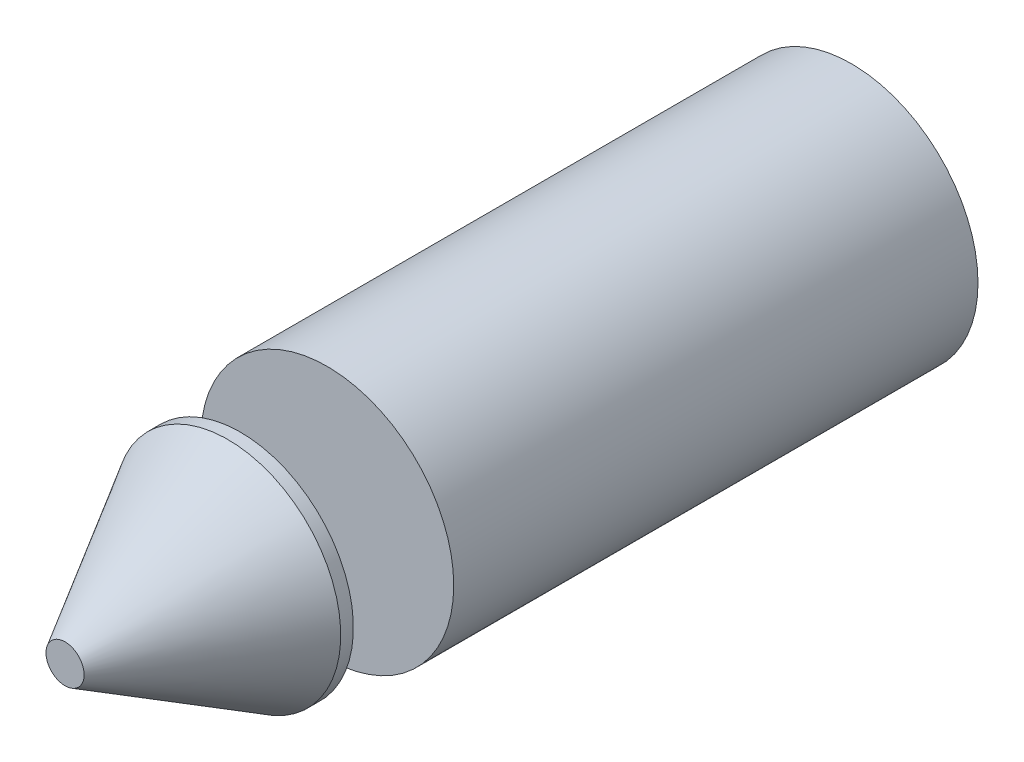
ISO-10303-21;
HEADER;
FILE_DESCRIPTION(('STEP AP214'),'2;1');
FILE_NAME('part.step','',(''),(''),'','','');
FILE_SCHEMA(('AUTOMOTIVE_DESIGN { 1 0 10303 214 1 1 1 1 }'));
ENDSEC;
DATA;
#1=APPLICATION_CONTEXT('core data for automotive mechanical design processes');
#2=APPLICATION_PROTOCOL_DEFINITION('international standard','automotive_design',2000,#1);
#3=PRODUCT_CONTEXT('',#1,'mechanical');
#4=PRODUCT('Part','Part','',(#3));
#5=PRODUCT_RELATED_PRODUCT_CATEGORY('part','',(#4));
#6=PRODUCT_DEFINITION_FORMATION('','',#4);
#7=PRODUCT_DEFINITION_CONTEXT('part definition',#1,'design');
#8=PRODUCT_DEFINITION('design','',#6,#7);
#9=PRODUCT_DEFINITION_SHAPE('','',#8);
#10=(LENGTH_UNIT() NAMED_UNIT(*) SI_UNIT(.MILLI.,.METRE.));
#11=(NAMED_UNIT(*) PLANE_ANGLE_UNIT() SI_UNIT($,.RADIAN.));
#12=(NAMED_UNIT(*) SI_UNIT($,.STERADIAN.) SOLID_ANGLE_UNIT());
#13=UNCERTAINTY_MEASURE_WITH_UNIT(LENGTH_MEASURE(1.E-05),#10,'distance_accuracy_value','');
#14=(GEOMETRIC_REPRESENTATION_CONTEXT(3) GLOBAL_UNCERTAINTY_ASSIGNED_CONTEXT((#13)) GLOBAL_UNIT_ASSIGNED_CONTEXT((#10,
#11,#12)) REPRESENTATION_CONTEXT('',''));
#15=CARTESIAN_POINT('',(0.,0.,0.));
#16=DIRECTION('',(0.,0.,1.));
#17=DIRECTION('',(1.,0.,0.));
#18=AXIS2_PLACEMENT_3D('',#15,#16,#17);
#19=CARTESIAN_POINT('',(0.,0.,110.49));
#20=DIRECTION('',(0.,0.,-1.));
#21=DIRECTION('',(-1.,0.,0.));
#22=AXIS2_PLACEMENT_3D('',#19,#20,#21);
#23=CYLINDRICAL_SURFACE('',#22,15.875);
#24=CARTESIAN_POINT('',(0.,0.,87.6299999999999));
#25=DIRECTION('',(0.,0.,1.));
#26=DIRECTION('',(1.,0.,0.));
#27=AXIS2_PLACEMENT_3D('',#24,#25,#26);
#28=CIRCLE('',#27,15.875);
#29=CARTESIAN_POINT('',(-15.875,0.,87.6299999999999));
#30=VERTEX_POINT('',#29);
#31=EDGE_CURVE('E11',#30,#30,#28,.F.);
#32=CARTESIAN_POINT('',(0.,0.,85.852));
#33=DIRECTION('',(0.,0.,1.));
#34=DIRECTION('',(1.,0.,0.));
#35=AXIS2_PLACEMENT_3D('',#32,#33,#34);
#36=CIRCLE('',#35,15.875);
#37=CARTESIAN_POINT('',(-15.875,0.,85.852));
#38=VERTEX_POINT('',#37);
#39=EDGE_CURVE('E51',#38,#38,#36,.T.);
#40=CARTESIAN_POINT('',(-15.875,0.,87.6299999999999));
#41=CARTESIAN_POINT('',(-15.875,0.,87.6114791666665));
#42=CARTESIAN_POINT('',(-15.875,0.,87.5929583333332));
#43=CARTESIAN_POINT('',(-15.875,0.,87.5559166666665));
#44=CARTESIAN_POINT('',(-15.875,0.,87.5373958333332));
#45=CARTESIAN_POINT('',(-15.875,0.,87.5003541666665));
#46=CARTESIAN_POINT('',(-15.875,0.,87.4818333333332));
#47=CARTESIAN_POINT('',(-15.875,0.,87.4447916666665));
#48=CARTESIAN_POINT('',(-15.875,0.,87.4262708333332));
#49=CARTESIAN_POINT('',(-15.875,0.,87.3892291666666));
#50=CARTESIAN_POINT('',(-15.875,0.,87.3707083333332));
#51=CARTESIAN_POINT('',(-15.875,0.,87.3336666666665));
#52=CARTESIAN_POINT('',(-15.875,0.,87.3151458333332));
#53=CARTESIAN_POINT('',(-15.875,0.,87.2781041666666));
#54=CARTESIAN_POINT('',(-15.875,0.,87.2595833333332));
#55=CARTESIAN_POINT('',(-15.875,0.,87.2225416666666));
#56=CARTESIAN_POINT('',(-15.875,0.,87.2040208333332));
#57=CARTESIAN_POINT('',(-15.875,0.,87.1669791666666));
#58=CARTESIAN_POINT('',(-15.875,0.,87.1484583333332));
#59=CARTESIAN_POINT('',(-15.875,0.,87.1114166666666));
#60=CARTESIAN_POINT('',(-15.875,0.,87.0928958333332));
#61=CARTESIAN_POINT('',(-15.875,0.,87.0558541666666));
#62=CARTESIAN_POINT('',(-15.875,0.,87.0373333333332));
#63=CARTESIAN_POINT('',(-15.875,0.,87.0002916666666));
#64=CARTESIAN_POINT('',(-15.875,0.,86.9817708333332));
#65=CARTESIAN_POINT('',(-15.875,0.,86.9447291666666));
#66=CARTESIAN_POINT('',(-15.875,0.,86.9262083333332));
#67=CARTESIAN_POINT('',(-15.875,0.,86.8891666666666));
#68=CARTESIAN_POINT('',(-15.875,0.,86.8706458333332));
#69=CARTESIAN_POINT('',(-15.875,0.,86.8336041666666));
#70=CARTESIAN_POINT('',(-15.875,0.,86.8150833333332));
#71=CARTESIAN_POINT('',(-15.875,0.,86.7780416666666));
#72=CARTESIAN_POINT('',(-15.875,0.,86.7595208333332));
#73=CARTESIAN_POINT('',(-15.875,0.,86.7224791666666));
#74=CARTESIAN_POINT('',(-15.875,0.,86.7039583333332));
#75=CARTESIAN_POINT('',(-15.875,0.,86.6669166666666));
#76=CARTESIAN_POINT('',(-15.875,0.,86.6483958333333));
#77=CARTESIAN_POINT('',(-15.875,0.,86.6113541666666));
#78=CARTESIAN_POINT('',(-15.875,0.,86.5928333333333));
#79=CARTESIAN_POINT('',(-15.875,0.,86.5557916666666));
#80=CARTESIAN_POINT('',(-15.875,0.,86.5372708333333));
#81=CARTESIAN_POINT('',(-15.875,0.,86.5002291666666));
#82=CARTESIAN_POINT('',(-15.875,0.,86.4817083333333));
#83=CARTESIAN_POINT('',(-15.875,0.,86.4446666666666));
#84=CARTESIAN_POINT('',(-15.875,0.,86.4261458333333));
#85=CARTESIAN_POINT('',(-15.875,0.,86.3891041666666));
#86=CARTESIAN_POINT('',(-15.875,0.,86.3705833333333));
#87=CARTESIAN_POINT('',(-15.875,0.,86.3335416666666));
#88=CARTESIAN_POINT('',(-15.875,0.,86.3150208333333));
#89=CARTESIAN_POINT('',(-15.875,0.,86.2779791666666));
#90=CARTESIAN_POINT('',(-15.875,0.,86.2594583333333));
#91=CARTESIAN_POINT('',(-15.875,0.,86.2224166666666));
#92=CARTESIAN_POINT('',(-15.875,0.,86.2038958333333));
#93=CARTESIAN_POINT('',(-15.875,0.,86.1668541666666));
#94=CARTESIAN_POINT('',(-15.875,0.,86.1483333333333));
#95=CARTESIAN_POINT('',(-15.875,0.,86.1112916666666));
#96=CARTESIAN_POINT('',(-15.875,0.,86.0927708333333));
#97=CARTESIAN_POINT('',(-15.875,0.,86.0557291666666));
#98=CARTESIAN_POINT('',(-15.875,0.,86.0372083333333));
#99=CARTESIAN_POINT('',(-15.875,0.,86.0001666666666));
#100=CARTESIAN_POINT('',(-15.875,0.,85.9816458333333));
#101=CARTESIAN_POINT('',(-15.875,0.,85.9446041666666));
#102=CARTESIAN_POINT('',(-15.875,0.,85.9260833333333));
#103=CARTESIAN_POINT('',(-15.875,0.,85.8890416666666));
#104=CARTESIAN_POINT('',(-15.875,0.,85.8705208333333));
#105=CARTESIAN_POINT('',(-15.875,0.,85.852));
#106=B_SPLINE_CURVE_WITH_KNOTS('',3,(#40,#41,#42,#43,#44,#45,#46,#47,#48,#49,#50,#51,#52,#53,
#54,#55,#56,#57,#58,#59,#60,#61,#62,#63,#64,#65,#66,#67,#68,#69,#70,#71,#72,#73,#74,#75,#76,#77,
#78,#79,#80,#81,#82,#83,#84,#85,#86,#87,#88,#89,#90,#91,#92,#93,#94,#95,#96,#97,#98,#99,#100,
#101,#102,#103,#104,#105),.UNSPECIFIED.,.F.,.F.,(4,2,2,2,2,2,2,2,2,2,2,2,2,2,2,2,2,2,2,2,2,2,2,
2,2,2,2,2,2,2,2,2,4),(0.,0.0555624999999949,0.11112499999999,0.166687499999985,
0.222249999999979,0.277812499999974,0.333374999999983,0.388937499999978,0.444499999999973,
0.500062499999968,0.555624999999962,0.611187499999957,0.666749999999952,0.722312499999947,
0.777874999999942,0.833437499999951,0.888999999999945,0.94456249999994,1.00012499999994,
1.05568749999993,1.11124999999992,1.16681249999992,1.22237499999993,1.27793749999992,
1.33349999999992,1.38906249999991,1.44462499999991,1.5001874999999,1.5557499999999,
1.61131249999989,1.66687499999989,1.7224374999999,1.77799999999989),.UNSPECIFIED.);
#107=EDGE_CURVE('BSEAM40',#30,#38,#106,.T.);
#108=ORIENTED_EDGE('',*,*,#31,.T.);
#109=ORIENTED_EDGE('',*,*,#39,.T.);
#110=ORIENTED_EDGE('',*,*,#107,.T.);
#111=ORIENTED_EDGE('',*,*,#107,.F.);
#112=EDGE_LOOP('',(#108,#110,#109,#111));
#113=FACE_BOUND('',#112,.T.);
#114=ADVANCED_FACE('F40',(#113),#23,.T.);
#115=CARTESIAN_POINT('',(0.,0.,110.49));
#116=DIRECTION('',(0.,0.,1.));
#117=DIRECTION('',(1.,0.,0.));
#118=AXIS2_PLACEMENT_3D('',#115,#116,#117);
#119=PLANE('',#118);
#120=CARTESIAN_POINT('',(0.,0.,110.49));
#121=DIRECTION('',(0.,0.,1.));
#122=DIRECTION('',(1.,0.,0.));
#123=AXIS2_PLACEMENT_3D('',#120,#121,#122);
#124=CIRCLE('',#123,2.67677284632518);
#125=CARTESIAN_POINT('',(-2.67677284632518,0.,110.49));
#126=VERTEX_POINT('',#125);
#127=EDGE_CURVE('E47',#126,#126,#124,.T.);
#128=ORIENTED_EDGE('',*,*,#127,.T.);
#129=EDGE_LOOP('',(#128));
#130=FACE_BOUND('',#129,.T.);
#131=ADVANCED_FACE('F61',(#130),#119,.T.);
#132=CARTESIAN_POINT('',(0.,0.,85.852));
#133=DIRECTION('',(0.,0.,1.));
#134=DIRECTION('',(1.,0.,0.));
#135=AXIS2_PLACEMENT_3D('',#132,#133,#134);
#136=PLANE('',#135);
#137=ORIENTED_EDGE('',*,*,#39,.F.);
#138=EDGE_LOOP('',(#137));
#139=FACE_BOUND('',#138,.T.);
#140=ADVANCED_FACE('F59',(#139),#136,.F.);
#141=CARTESIAN_POINT('',(0.,0.,110.49));
#142=DIRECTION('',(0.,0.,-1.));
#143=DIRECTION('',(-1.,0.,0.));
#144=AXIS2_PLACEMENT_3D('',#141,#142,#143);
#145=CONICAL_SURFACE('',#144,2.67677284632518,0.523598775598296);
#146=CARTESIAN_POINT('',(-15.875,0.,87.6299999999999));
#147=CARTESIAN_POINT('',(-15.7375184671492,0.,87.8681249999999));
#148=CARTESIAN_POINT('',(-15.6000369342984,0.,88.1062499999999));
#149=CARTESIAN_POINT('',(-15.3250738685969,0.,88.5824999999999));
#150=CARTESIAN_POINT('',(-15.1875923357461,0.,88.8206249999999));
#151=CARTESIAN_POINT('',(-14.9126292700446,0.,89.2968749999999));
#152=CARTESIAN_POINT('',(-14.7751477371938,0.,89.5349999999999));
#153=CARTESIAN_POINT('',(-14.5001846714922,0.,90.0112499999999));
#154=CARTESIAN_POINT('',(-14.3627031386414,0.,90.2493749999999));
#155=CARTESIAN_POINT('',(-14.0877400729399,0.,90.7256249999999));
#156=CARTESIAN_POINT('',(-13.9502585400891,0.,90.9637499999999));
#157=CARTESIAN_POINT('',(-13.6752954743875,0.,91.4399999999999));
#158=CARTESIAN_POINT('',(-13.5378139415368,0.,91.6781249999999));
#159=CARTESIAN_POINT('',(-13.2628508758352,0.,92.1543749999999));
#160=CARTESIAN_POINT('',(-13.1253693429844,0.,92.3924999999999));
#161=CARTESIAN_POINT('',(-12.8504062772829,0.,92.8687499999999));
#162=CARTESIAN_POINT('',(-12.7129247444321,0.,93.1068749999999));
#163=CARTESIAN_POINT('',(-12.4379616787305,0.,93.5831249999999));
#164=CARTESIAN_POINT('',(-12.3004801458797,0.,93.8212499999999));
#165=CARTESIAN_POINT('',(-12.0255170801782,0.,94.2974999999999));
#166=CARTESIAN_POINT('',(-11.8880355473274,0.,94.5356249999999));
#167=CARTESIAN_POINT('',(-11.6130724816258,0.,95.0118749999999));
#168=CARTESIAN_POINT('',(-11.4755909487751,0.,95.2499999999999));
#169=CARTESIAN_POINT('',(-11.2006278830735,0.,95.7262499999999));
#170=CARTESIAN_POINT('',(-11.0631463502227,0.,95.9643749999999));
#171=CARTESIAN_POINT('',(-10.7881832845212,0.,96.4406249999999));
#172=CARTESIAN_POINT('',(-10.6507017516704,0.,96.6787499999999));
#173=CARTESIAN_POINT('',(-10.3757386859688,0.,97.1549999999999));
#174=CARTESIAN_POINT('',(-10.2382571531181,0.,97.3931249999999));
#175=CARTESIAN_POINT('',(-9.96329408741649,0.,97.8693749999999));
#176=CARTESIAN_POINT('',(-9.82581255456571,0.,98.1074999999999));
#177=CARTESIAN_POINT('',(-9.55084948886415,0.,98.5837499999999));
#178=CARTESIAN_POINT('',(-9.41336795601338,0.,98.8218749999999));
#179=CARTESIAN_POINT('',(-9.13840489031182,0.,99.2981249999999));
#180=CARTESIAN_POINT('',(-9.00092335746103,0.,99.5362499999999));
#181=CARTESIAN_POINT('',(-8.72596029175948,0.,100.0125));
#182=CARTESIAN_POINT('',(-8.5884787589087,0.,100.250625));
#183=CARTESIAN_POINT('',(-8.31351569320714,0.,100.726875));
#184=CARTESIAN_POINT('',(-8.17603416035636,0.,100.965));
#185=CARTESIAN_POINT('',(-7.9010710946548,0.,101.44125));
#186=CARTESIAN_POINT('',(-7.76358956180402,0.,101.679375));
#187=CARTESIAN_POINT('',(-7.48862649610246,0.,102.155625));
#188=CARTESIAN_POINT('',(-7.35114496325168,0.,102.39375));
#189=CARTESIAN_POINT('',(-7.07618189755012,0.,102.87));
#190=CARTESIAN_POINT('',(-6.93870036469935,0.,103.108125));
#191=CARTESIAN_POINT('',(-6.66373729899779,0.,103.584375));
#192=CARTESIAN_POINT('',(-6.52625576614701,0.,103.8225));
#193=CARTESIAN_POINT('',(-6.25129270044545,0.,104.29875));
#194=CARTESIAN_POINT('',(-6.11381116759467,0.,104.536875));
#195=CARTESIAN_POINT('',(-5.83884810189311,0.,105.013125));
#196=CARTESIAN_POINT('',(-5.70136656904233,0.,105.25125));
#197=CARTESIAN_POINT('',(-5.42640350334077,0.,105.7275));
#198=CARTESIAN_POINT('',(-5.28892197048999,0.,105.965625));
#199=CARTESIAN_POINT('',(-5.01395890478844,0.,106.441875));
#200=CARTESIAN_POINT('',(-4.87647737193765,0.,106.68));
#201=CARTESIAN_POINT('',(-4.6015143062361,0.,107.15625));
#202=CARTESIAN_POINT('',(-4.46403277338532,0.,107.394375));
#203=CARTESIAN_POINT('',(-4.18906970768376,0.,107.870625));
#204=CARTESIAN_POINT('',(-4.05158817483298,0.,108.10875));
#205=CARTESIAN_POINT('',(-3.77662510913142,0.,108.585));
#206=CARTESIAN_POINT('',(-3.63914357628064,0.,108.823125));
#207=CARTESIAN_POINT('',(-3.36418051057908,0.,109.299375));
#208=CARTESIAN_POINT('',(-3.2266989777283,0.,109.5375));
#209=CARTESIAN_POINT('',(-2.95173591202674,0.,110.01375));
#210=CARTESIAN_POINT('',(-2.81425437917596,0.,110.251875));
#211=CARTESIAN_POINT('',(-2.67677284632518,0.,110.49));
#212=B_SPLINE_CURVE_WITH_KNOTS('',3,(#146,#147,#148,#149,#150,#151,#152,#153,#154,#155,#156,
#157,#158,#159,#160,#161,#162,#163,#164,#165,#166,#167,#168,#169,#170,#171,#172,#173,#174,#175,
#176,#177,#178,#179,#180,#181,#182,#183,#184,#185,#186,#187,#188,#189,#190,#191,#192,#193,#194,
#195,#196,#197,#198,#199,#200,#201,#202,#203,#204,#205,#206,#207,#208,#209,#210,#211),
.UNSPECIFIED.,.F.,.F.,(4,2,2,2,2,2,2,2,2,2,2,2,2,2,2,2,2,2,2,2,2,2,2,2,2,2,2,2,2,2,2,2,4),(0.,
0.82488919710467,1.64977839420936,2.47466759131403,3.29955678841872,4.12444598552339,
4.94933518262808,5.77422437973275,6.59911357683744,7.42400277394211,8.2488919710468,
9.07378116815147,9.89867036525616,10.7235595623608,11.5484487594655,12.3733379565702,
13.1982271536749,14.0231163507796,14.8480055478842,15.6728947449889,16.4977839420936,
17.3226731391983,18.147562336303,18.9724515334076,19.7973407305123,20.622229927617,
21.4471191247217,22.2720083218264,23.096897518931,23.9217867160357,24.7466759131404,
25.5715651102451,26.3964543073498),.UNSPECIFIED.);
#213=EDGE_CURVE('BSEAM42',#30,#126,#212,.T.);
#214=ORIENTED_EDGE('',*,*,#31,.F.);
#215=ORIENTED_EDGE('',*,*,#127,.F.);
#216=ORIENTED_EDGE('',*,*,#213,.T.);
#217=ORIENTED_EDGE('',*,*,#213,.F.);
#218=EDGE_LOOP('',(#214,#216,#215,#217));
#219=FACE_BOUND('',#218,.T.);
#220=ADVANCED_FACE('F42',(#219),#145,.T.);
#221=CLOSED_SHELL('',(#114,#131,#140,#220));
#222=MANIFOLD_SOLID_BREP('B2',#221);
#223=CARTESIAN_POINT('',(0.,0.,73.66));
#224=DIRECTION('',(0.,0.,-1.));
#225=DIRECTION('',(-1.,0.,0.));
#226=AXIS2_PLACEMENT_3D('',#223,#224,#225);
#227=CYLINDRICAL_SURFACE('',#226,17.78);
#228=CARTESIAN_POINT('',(0.,0.,73.66));
#229=DIRECTION('',(0.,0.,1.));
#230=DIRECTION('',(1.,0.,0.));
#231=AXIS2_PLACEMENT_3D('',#228,#229,#230);
#232=CIRCLE('',#231,17.78);
#233=CARTESIAN_POINT('',(17.78,0.,73.66));
#234=VERTEX_POINT('',#233);
#235=EDGE_CURVE('E39',#234,#234,#232,.T.);
#236=ORIENTED_EDGE('',*,*,#235,.F.);
#237=EDGE_LOOP('',(#236));
#238=FACE_BOUND('',#237,.T.);
#239=CARTESIAN_POINT('',(0.,0.,0.));
#240=DIRECTION('',(0.,0.,1.));
#241=DIRECTION('',(1.,0.,0.));
#242=AXIS2_PLACEMENT_3D('',#239,#240,#241);
#243=CIRCLE('',#242,17.78);
#244=CARTESIAN_POINT('',(17.78,0.,0.));
#245=VERTEX_POINT('',#244);
#246=EDGE_CURVE('E100',#245,#245,#243,.T.);
#247=ORIENTED_EDGE('',*,*,#246,.T.);
#248=EDGE_LOOP('',(#247));
#249=FACE_BOUND('',#248,.T.);
#250=ADVANCED_FACE('F97',(#238,#249),#227,.T.);
#251=CARTESIAN_POINT('',(0.,0.,73.66));
#252=DIRECTION('',(0.,0.,1.));
#253=DIRECTION('',(1.,0.,0.));
#254=AXIS2_PLACEMENT_3D('',#251,#252,#253);
#255=PLANE('',#254);
#256=ORIENTED_EDGE('',*,*,#235,.T.);
#257=EDGE_LOOP('',(#256));
#258=FACE_BOUND('',#257,.T.);
#259=ADVANCED_FACE('F112',(#258),#255,.T.);
#260=CARTESIAN_POINT('',(0.,0.,0.));
#261=DIRECTION('',(0.,0.,1.));
#262=DIRECTION('',(1.,0.,0.));
#263=AXIS2_PLACEMENT_3D('',#260,#261,#262);
#264=PLANE('',#263);
#265=ORIENTED_EDGE('',*,*,#246,.F.);
#266=EDGE_LOOP('',(#265));
#267=FACE_BOUND('',#266,.T.);
#268=ADVANCED_FACE('F110',(#267),#264,.F.);
#269=CLOSED_SHELL('',(#250,#259,#268));
#270=MANIFOLD_SOLID_BREP('B6',#269);
#271=ADVANCED_BREP_SHAPE_REPRESENTATION('',(#18,#222,#270),#14);
#272=SHAPE_DEFINITION_REPRESENTATION(#9,#271);
ENDSEC;
END-ISO-10303-21;
